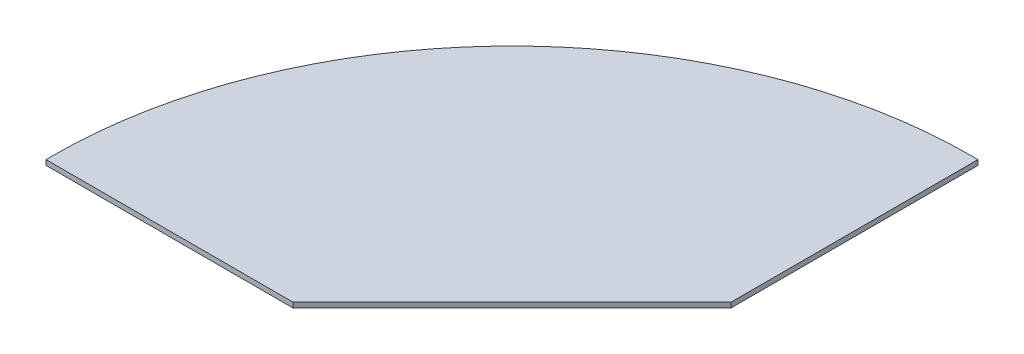
ISO-10303-21;
HEADER;
FILE_DESCRIPTION(('STEP AP214'),'2;1');
FILE_NAME('part.step','',(''),(''),'','','');
FILE_SCHEMA(('AUTOMOTIVE_DESIGN { 1 0 10303 214 1 1 1 1 }'));
ENDSEC;
DATA;
#1=APPLICATION_CONTEXT('core data for automotive mechanical design processes');
#2=APPLICATION_PROTOCOL_DEFINITION('international standard','automotive_design',2000,#1);
#3=PRODUCT_CONTEXT('',#1,'mechanical');
#4=PRODUCT('Part','Part','',(#3));
#5=PRODUCT_RELATED_PRODUCT_CATEGORY('part','',(#4));
#6=PRODUCT_DEFINITION_FORMATION('','',#4);
#7=PRODUCT_DEFINITION_CONTEXT('part definition',#1,'design');
#8=PRODUCT_DEFINITION('design','',#6,#7);
#9=PRODUCT_DEFINITION_SHAPE('','',#8);
#10=(LENGTH_UNIT() NAMED_UNIT(*) SI_UNIT(.MILLI.,.METRE.));
#11=(NAMED_UNIT(*) PLANE_ANGLE_UNIT() SI_UNIT($,.RADIAN.));
#12=(NAMED_UNIT(*) SI_UNIT($,.STERADIAN.) SOLID_ANGLE_UNIT());
#13=UNCERTAINTY_MEASURE_WITH_UNIT(LENGTH_MEASURE(1.E-05),#10,'distance_accuracy_value','');
#14=(GEOMETRIC_REPRESENTATION_CONTEXT(3) GLOBAL_UNCERTAINTY_ASSIGNED_CONTEXT((#13)) GLOBAL_UNIT_ASSIGNED_CONTEXT((#10,
#11,#12)) REPRESENTATION_CONTEXT('',''));
#15=CARTESIAN_POINT('',(0.,0.,0.));
#16=DIRECTION('',(0.,0.,1.));
#17=DIRECTION('',(1.,0.,0.));
#18=AXIS2_PLACEMENT_3D('',#15,#16,#17);
#19=CARTESIAN_POINT('',(7.47024208356757,-0.8,27.6332445193929));
#20=DIRECTION('',(0.,1.,0.));
#21=DIRECTION('',(0.,0.,1.));
#22=AXIS2_PLACEMENT_3D('',#19,#20,#21);
#23=CYLINDRICAL_SURFACE('',#22,73.);
#24=CARTESIAN_POINT('',(7.47024208356757,0.,27.6332445193929));
#25=DIRECTION('',(0.,1.,0.));
#26=DIRECTION('',(0.,0.,-1.));
#27=AXIS2_PLACEMENT_3D('',#24,#25,#26);
#28=CIRCLE('',#27,73.);
#29=CARTESIAN_POINT('',(7.47024208356808,0.,-45.3667554806071));
#30=VERTEX_POINT('',#29);
#31=CARTESIAN_POINT('',(-65.5297579164324,0.,27.6332445193934));
#32=VERTEX_POINT('',#31);
#33=EDGE_CURVE('E118',#30,#32,#28,.T.);
#34=ORIENTED_EDGE('',*,*,#33,.F.);
#35=DIRECTION('',(0.,1.,0.));
#36=VECTOR('',#35,1.);
#37=CARTESIAN_POINT('',(7.47024208356808,-0.8,-45.3667554806071));
#38=LINE('',#37,#36);
#39=CARTESIAN_POINT('',(7.47024208356808,-0.8,-45.3667554806071));
#40=VERTEX_POINT('',#39);
#41=EDGE_CURVE('E11',#40,#30,#38,.T.);
#42=ORIENTED_EDGE('',*,*,#41,.F.);
#43=CARTESIAN_POINT('',(7.47024208356757,-0.8,27.6332445193929));
#44=DIRECTION('',(0.,1.,0.));
#45=DIRECTION('',(0.,0.,-1.));
#46=AXIS2_PLACEMENT_3D('',#43,#44,#45);
#47=CIRCLE('',#46,73.);
#48=CARTESIAN_POINT('',(-65.5297579164324,-0.8,27.6332445193934));
#49=VERTEX_POINT('',#48);
#50=EDGE_CURVE('E132',#40,#49,#47,.T.);
#51=ORIENTED_EDGE('',*,*,#50,.T.);
#52=DIRECTION('',(0.,1.,0.));
#53=VECTOR('',#52,1.);
#54=CARTESIAN_POINT('',(-65.5297579164324,-0.8,27.6332445193934));
#55=LINE('',#54,#53);
#56=EDGE_CURVE('E36',#49,#32,#55,.T.);
#57=ORIENTED_EDGE('',*,*,#56,.T.);
#58=EDGE_LOOP('',(#34,#42,#51,#57));
#59=FACE_BOUND('',#58,.T.);
#60=ADVANCED_FACE('F33',(#59),#23,.T.);
#61=CARTESIAN_POINT('',(7.47024208356808,-0.8,-45.3667554806071));
#62=DIRECTION('',(0.,0.,-1.));
#63=DIRECTION('',(-1.,0.,0.));
#64=AXIS2_PLACEMENT_3D('',#61,#62,#63);
#65=PLANE('',#64);
#66=DIRECTION('',(-1.,0.,0.));
#67=VECTOR('',#66,1.);
#68=CARTESIAN_POINT('',(7.47024208356808,0.,-45.3667554806071));
#69=LINE('',#68,#67);
#70=CARTESIAN_POINT('',(8.47024208356757,0.,-45.3667554806071));
#71=VERTEX_POINT('',#70);
#72=EDGE_CURVE('E130',#71,#30,#69,.T.);
#73=ORIENTED_EDGE('',*,*,#72,.F.);
#74=DIRECTION('',(0.,1.,0.));
#75=VECTOR('',#74,1.);
#76=CARTESIAN_POINT('',(8.47024208356757,-0.8,-45.3667554806071));
#77=LINE('',#76,#75);
#78=CARTESIAN_POINT('',(8.47024208356757,-0.8,-45.3667554806071));
#79=VERTEX_POINT('',#78);
#80=EDGE_CURVE('E42',#79,#71,#77,.T.);
#81=ORIENTED_EDGE('',*,*,#80,.F.);
#82=DIRECTION('',(-1.,0.,0.));
#83=VECTOR('',#82,1.);
#84=CARTESIAN_POINT('',(7.47024208356808,-0.8,-45.3667554806071));
#85=LINE('',#84,#83);
#86=EDGE_CURVE('E108',#79,#40,#85,.T.);
#87=ORIENTED_EDGE('',*,*,#86,.T.);
#88=ORIENTED_EDGE('',*,*,#41,.T.);
#89=EDGE_LOOP('',(#73,#81,#87,#88));
#90=FACE_BOUND('',#89,.T.);
#91=ADVANCED_FACE('F140',(#90),#65,.T.);
#92=CARTESIAN_POINT('',(8.47024208356757,-0.8,-45.3667554806071));
#93=DIRECTION('',(1.,0.,0.));
#94=DIRECTION('',(0.,0.,-1.));
#95=AXIS2_PLACEMENT_3D('',#92,#93,#94);
#96=PLANE('',#95);
#97=DIRECTION('',(0.,0.,-1.));
#98=VECTOR('',#97,1.);
#99=CARTESIAN_POINT('',(8.47024208356757,0.,-45.3667554806071));
#100=LINE('',#99,#98);
#101=CARTESIAN_POINT('',(8.47024208356758,0.,-6.16675548060706));
#102=VERTEX_POINT('',#101);
#103=EDGE_CURVE('E95',#102,#71,#100,.T.);
#104=ORIENTED_EDGE('',*,*,#103,.F.);
#105=DIRECTION('',(0.,1.,0.));
#106=VECTOR('',#105,1.);
#107=CARTESIAN_POINT('',(8.47024208356758,-0.8,-6.16675548060706));
#108=LINE('',#107,#106);
#109=CARTESIAN_POINT('',(8.47024208356758,-0.8,-6.16675548060706));
#110=VERTEX_POINT('',#109);
#111=EDGE_CURVE('E90',#110,#102,#108,.T.);
#112=ORIENTED_EDGE('',*,*,#111,.F.);
#113=DIRECTION('',(0.,0.,-1.));
#114=VECTOR('',#113,1.);
#115=CARTESIAN_POINT('',(8.47024208356757,-0.8,-45.3667554806071));
#116=LINE('',#115,#114);
#117=EDGE_CURVE('E93',#110,#79,#116,.T.);
#118=ORIENTED_EDGE('',*,*,#117,.T.);
#119=ORIENTED_EDGE('',*,*,#80,.T.);
#120=EDGE_LOOP('',(#104,#112,#118,#119));
#121=FACE_BOUND('',#120,.T.);
#122=ADVANCED_FACE('F92',(#121),#96,.T.);
#123=CARTESIAN_POINT('',(-26.3297579164324,-0.8,28.6332445193929));
#124=DIRECTION('',(0.707106781186548,0.,0.707106781186548));
#125=DIRECTION('',(0.707106781186548,0.,-0.707106781186548));
#126=AXIS2_PLACEMENT_3D('',#123,#124,#125);
#127=PLANE('',#126);
#128=DIRECTION('',(0.707106781186548,0.,-0.707106781186547));
#129=VECTOR('',#128,1.);
#130=CARTESIAN_POINT('',(-26.3297579164324,0.,28.6332445193929));
#131=LINE('',#130,#129);
#132=CARTESIAN_POINT('',(-26.3297579164324,0.,28.6332445193929));
#133=VERTEX_POINT('',#132);
#134=EDGE_CURVE('E127',#133,#102,#131,.T.);
#135=ORIENTED_EDGE('',*,*,#134,.F.);
#136=DIRECTION('',(0.,1.,0.));
#137=VECTOR('',#136,1.);
#138=CARTESIAN_POINT('',(-26.3297579164324,-0.8,28.6332445193929));
#139=LINE('',#138,#137);
#140=CARTESIAN_POINT('',(-26.3297579164324,-0.8,28.6332445193929));
#141=VERTEX_POINT('',#140);
#142=EDGE_CURVE('E100',#141,#133,#139,.T.);
#143=ORIENTED_EDGE('',*,*,#142,.F.);
#144=DIRECTION('',(0.707106781186548,0.,-0.707106781186547));
#145=VECTOR('',#144,1.);
#146=CARTESIAN_POINT('',(-26.3297579164324,-0.8,28.6332445193929));
#147=LINE('',#146,#145);
#148=EDGE_CURVE('E106',#141,#110,#147,.T.);
#149=ORIENTED_EDGE('',*,*,#148,.T.);
#150=ORIENTED_EDGE('',*,*,#111,.T.);
#151=EDGE_LOOP('',(#135,#143,#149,#150));
#152=FACE_BOUND('',#151,.T.);
#153=ADVANCED_FACE('F110',(#152),#127,.T.);
#154=CARTESIAN_POINT('',(-65.5297579164324,-0.8,28.6332445193929));
#155=DIRECTION('',(0.,0.,1.));
#156=DIRECTION('',(1.,0.,0.));
#157=AXIS2_PLACEMENT_3D('',#154,#155,#156);
#158=PLANE('',#157);
#159=DIRECTION('',(1.,0.,0.));
#160=VECTOR('',#159,1.);
#161=CARTESIAN_POINT('',(-65.5297579164324,0.,28.6332445193929));
#162=LINE('',#161,#160);
#163=CARTESIAN_POINT('',(-65.5297579164324,0.,28.6332445193929));
#164=VERTEX_POINT('',#163);
#165=EDGE_CURVE('E124',#164,#133,#162,.T.);
#166=ORIENTED_EDGE('',*,*,#165,.F.);
#167=DIRECTION('',(0.,1.,0.));
#168=VECTOR('',#167,1.);
#169=CARTESIAN_POINT('',(-65.5297579164324,-0.8,28.6332445193929));
#170=LINE('',#169,#168);
#171=CARTESIAN_POINT('',(-65.5297579164324,-0.8,28.6332445193929));
#172=VERTEX_POINT('',#171);
#173=EDGE_CURVE('E135',#172,#164,#170,.T.);
#174=ORIENTED_EDGE('',*,*,#173,.F.);
#175=DIRECTION('',(1.,0.,0.));
#176=VECTOR('',#175,1.);
#177=CARTESIAN_POINT('',(-65.5297579164324,-0.8,28.6332445193929));
#178=LINE('',#177,#176);
#179=EDGE_CURVE('E111',#172,#141,#178,.T.);
#180=ORIENTED_EDGE('',*,*,#179,.T.);
#181=ORIENTED_EDGE('',*,*,#142,.T.);
#182=EDGE_LOOP('',(#166,#174,#180,#181));
#183=FACE_BOUND('',#182,.T.);
#184=ADVANCED_FACE('F153',(#183),#158,.T.);
#185=CARTESIAN_POINT('',(-65.5297579164324,-0.8,28.6332445193929));
#186=DIRECTION('',(-1.,0.,0.));
#187=DIRECTION('',(0.,0.,1.));
#188=AXIS2_PLACEMENT_3D('',#185,#186,#187);
#189=PLANE('',#188);
#190=DIRECTION('',(0.,0.,1.));
#191=VECTOR('',#190,1.);
#192=CARTESIAN_POINT('',(-65.5297579164324,0.,28.6332445193929));
#193=LINE('',#192,#191);
#194=EDGE_CURVE('E121',#32,#164,#193,.T.);
#195=ORIENTED_EDGE('',*,*,#194,.F.);
#196=ORIENTED_EDGE('',*,*,#56,.F.);
#197=DIRECTION('',(0.,0.,1.));
#198=VECTOR('',#197,1.);
#199=CARTESIAN_POINT('',(-65.5297579164324,-0.8,28.6332445193929));
#200=LINE('',#199,#198);
#201=EDGE_CURVE('E113',#49,#172,#200,.T.);
#202=ORIENTED_EDGE('',*,*,#201,.T.);
#203=ORIENTED_EDGE('',*,*,#173,.T.);
#204=EDGE_LOOP('',(#195,#196,#202,#203));
#205=FACE_BOUND('',#204,.T.);
#206=ADVANCED_FACE('F137',(#205),#189,.T.);
#207=CARTESIAN_POINT('',(7.47024208356757,-0.8,27.6332445193929));
#208=DIRECTION('',(0.,-1.,0.));
#209=DIRECTION('',(0.,0.,-1.));
#210=AXIS2_PLACEMENT_3D('',#207,#208,#209);
#211=PLANE('',#210);
#212=ORIENTED_EDGE('',*,*,#50,.F.);
#213=ORIENTED_EDGE('',*,*,#86,.F.);
#214=ORIENTED_EDGE('',*,*,#117,.F.);
#215=ORIENTED_EDGE('',*,*,#148,.F.);
#216=ORIENTED_EDGE('',*,*,#179,.F.);
#217=ORIENTED_EDGE('',*,*,#201,.F.);
#218=EDGE_LOOP('',(#212,#213,#214,#215,#216,#217));
#219=FACE_BOUND('',#218,.T.);
#220=ADVANCED_FACE('F104',(#219),#211,.T.);
#221=CARTESIAN_POINT('',(7.47024208356757,0.,27.6332445193929));
#222=DIRECTION('',(0.,-1.,0.));
#223=DIRECTION('',(0.,0.,-1.));
#224=AXIS2_PLACEMENT_3D('',#221,#222,#223);
#225=PLANE('',#224);
#226=ORIENTED_EDGE('',*,*,#33,.T.);
#227=ORIENTED_EDGE('',*,*,#194,.T.);
#228=ORIENTED_EDGE('',*,*,#165,.T.);
#229=ORIENTED_EDGE('',*,*,#134,.T.);
#230=ORIENTED_EDGE('',*,*,#103,.T.);
#231=ORIENTED_EDGE('',*,*,#72,.T.);
#232=EDGE_LOOP('',(#226,#227,#228,#229,#230,#231));
#233=FACE_BOUND('',#232,.T.);
#234=ADVANCED_FACE('F139',(#233),#225,.F.);
#235=CLOSED_SHELL('',(#60,#91,#122,#153,#184,#206,#220,#234));
#236=MANIFOLD_SOLID_BREP('B2',#235);
#237=ADVANCED_BREP_SHAPE_REPRESENTATION('',(#18,#236),#14);
#238=SHAPE_DEFINITION_REPRESENTATION(#9,#237);
ENDSEC;
END-ISO-10303-21;
